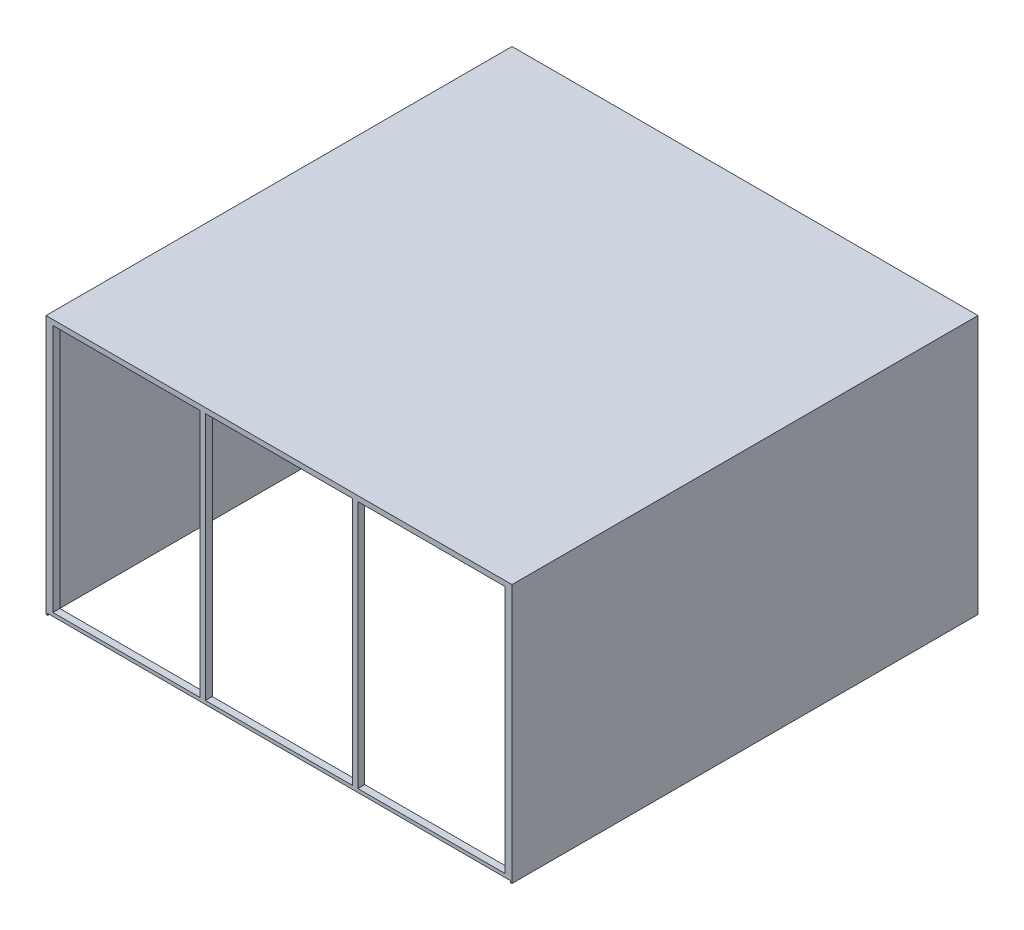
ISO-10303-21;
HEADER;
FILE_DESCRIPTION(('STEP AP214'),'2;1');
FILE_NAME('part.step','',(''),(''),'','','');
FILE_SCHEMA(('AUTOMOTIVE_DESIGN { 1 0 10303 214 1 1 1 1 }'));
ENDSEC;
DATA;
#1=APPLICATION_CONTEXT('core data for automotive mechanical design processes');
#2=APPLICATION_PROTOCOL_DEFINITION('international standard','automotive_design',2000,#1);
#3=PRODUCT_CONTEXT('',#1,'mechanical');
#4=PRODUCT('Part','Part','',(#3));
#5=PRODUCT_RELATED_PRODUCT_CATEGORY('part','',(#4));
#6=PRODUCT_DEFINITION_FORMATION('','',#4);
#7=PRODUCT_DEFINITION_CONTEXT('part definition',#1,'design');
#8=PRODUCT_DEFINITION('design','',#6,#7);
#9=PRODUCT_DEFINITION_SHAPE('','',#8);
#10=(LENGTH_UNIT() NAMED_UNIT(*) SI_UNIT(.MILLI.,.METRE.));
#11=(NAMED_UNIT(*) PLANE_ANGLE_UNIT() SI_UNIT($,.RADIAN.));
#12=(NAMED_UNIT(*) SI_UNIT($,.STERADIAN.) SOLID_ANGLE_UNIT());
#13=UNCERTAINTY_MEASURE_WITH_UNIT(LENGTH_MEASURE(1.E-05),#10,'distance_accuracy_value','');
#14=(GEOMETRIC_REPRESENTATION_CONTEXT(3) GLOBAL_UNCERTAINTY_ASSIGNED_CONTEXT((#13)) GLOBAL_UNIT_ASSIGNED_CONTEXT((#10,
#11,#12)) REPRESENTATION_CONTEXT('',''));
#15=CARTESIAN_POINT('',(0.,0.,0.));
#16=DIRECTION('',(0.,0.,1.));
#17=DIRECTION('',(1.,0.,0.));
#18=AXIS2_PLACEMENT_3D('',#15,#16,#17);
#19=CARTESIAN_POINT('',(-337.5,375.,0.));
#20=DIRECTION('',(1.,0.,0.));
#21=DIRECTION('',(0.,0.,-1.));
#22=AXIS2_PLACEMENT_3D('',#19,#20,#21);
#23=PLANE('',#22);
#24=DIRECTION('',(0.,0.,1.));
#25=VECTOR('',#24,1.);
#26=CARTESIAN_POINT('',(-337.5,0.,0.));
#27=LINE('',#26,#25);
#28=CARTESIAN_POINT('',(-337.5,0.,-675.));
#29=VERTEX_POINT('',#28);
#30=CARTESIAN_POINT('',(-337.5,0.,0.));
#31=VERTEX_POINT('',#30);
#32=EDGE_CURVE('E397',#29,#31,#27,.T.);
#33=ORIENTED_EDGE('',*,*,#32,.T.);
#34=DIRECTION('',(0.,-1.,0.));
#35=VECTOR('',#34,1.);
#36=CARTESIAN_POINT('',(-337.5,375.,0.));
#37=LINE('',#36,#35);
#38=CARTESIAN_POINT('',(-337.5,375.,0.));
#39=VERTEX_POINT('',#38);
#40=EDGE_CURVE('E447',#39,#31,#37,.T.);
#41=ORIENTED_EDGE('',*,*,#40,.F.);
#42=DIRECTION('',(0.,0.,1.));
#43=VECTOR('',#42,1.);
#44=CARTESIAN_POINT('',(-337.5,375.,0.));
#45=LINE('',#44,#43);
#46=CARTESIAN_POINT('',(-337.5,375.,-675.));
#47=VERTEX_POINT('',#46);
#48=EDGE_CURVE('E408',#47,#39,#45,.T.);
#49=ORIENTED_EDGE('',*,*,#48,.F.);
#50=DIRECTION('',(0.,-1.,0.));
#51=VECTOR('',#50,1.);
#52=CARTESIAN_POINT('',(-337.5,375.,-675.));
#53=LINE('',#52,#51);
#54=EDGE_CURVE('E422',#47,#29,#53,.T.);
#55=ORIENTED_EDGE('',*,*,#54,.T.);
#56=EDGE_LOOP('',(#33,#41,#49,#55));
#57=FACE_BOUND('',#56,.T.);
#58=ADVANCED_FACE('F45',(#57),#23,.F.);
#59=CARTESIAN_POINT('',(337.5,375.,-1.24301650113456E-13));
#60=DIRECTION('',(0.,0.,-1.));
#61=DIRECTION('',(-1.,0.,0.));
#62=AXIS2_PLACEMENT_3D('',#59,#60,#61);
#63=PLANE('',#62);
#64=DIRECTION('',(-1.,0.,0.));
#65=VECTOR('',#64,1.);
#66=CARTESIAN_POINT('',(114.17,367.5,0.));
#67=LINE('',#66,#65);
#68=CARTESIAN_POINT('',(327.5,367.5,-1.21240033115588E-13));
#69=VERTEX_POINT('',#68);
#70=CARTESIAN_POINT('',(114.17,367.5,0.));
#71=VERTEX_POINT('',#70);
#72=EDGE_CURVE('E275',#69,#71,#67,.T.);
#73=ORIENTED_EDGE('',*,*,#72,.F.);
#74=DIRECTION('',(0.,1.,0.));
#75=VECTOR('',#74,1.);
#76=CARTESIAN_POINT('',(327.5,367.5,0.));
#77=LINE('',#76,#75);
#78=CARTESIAN_POINT('',(327.5,7.50000000000008,0.));
#79=VERTEX_POINT('',#78);
#80=EDGE_CURVE('E60',#79,#69,#77,.T.);
#81=ORIENTED_EDGE('',*,*,#80,.F.);
#82=DIRECTION('',(1.,0.,0.));
#83=VECTOR('',#82,1.);
#84=CARTESIAN_POINT('',(327.5,7.50000000000008,0.));
#85=LINE('',#84,#83);
#86=CARTESIAN_POINT('',(114.17,7.50000000000008,0.));
#87=VERTEX_POINT('',#86);
#88=EDGE_CURVE('E266',#87,#79,#85,.T.);
#89=ORIENTED_EDGE('',*,*,#88,.F.);
#90=DIRECTION('',(0.,-1.,0.));
#91=VECTOR('',#90,1.);
#92=CARTESIAN_POINT('',(114.17,7.50000000000008,0.));
#93=LINE('',#92,#91);
#94=EDGE_CURVE('E270',#71,#87,#93,.T.);
#95=ORIENTED_EDGE('',*,*,#94,.F.);
#96=EDGE_LOOP('',(#73,#81,#89,#95));
#97=FACE_BOUND('',#96,.T.);
#98=DIRECTION('',(1.,0.,0.));
#99=VECTOR('',#98,1.);
#100=CARTESIAN_POINT('',(-114.17,7.50000000000011,0.));
#101=LINE('',#100,#99);
#102=CARTESIAN_POINT('',(-327.5,7.50000000000001,0.));
#103=VERTEX_POINT('',#102);
#104=CARTESIAN_POINT('',(-114.17,7.50000000000011,0.));
#105=VERTEX_POINT('',#104);
#106=EDGE_CURVE('E228',#103,#105,#101,.T.);
#107=ORIENTED_EDGE('',*,*,#106,.F.);
#108=DIRECTION('',(0.,-1.,0.));
#109=VECTOR('',#108,1.);
#110=CARTESIAN_POINT('',(-327.5,7.50000000000001,0.));
#111=LINE('',#110,#109);
#112=CARTESIAN_POINT('',(-327.5,367.5,0.));
#113=VERTEX_POINT('',#112);
#114=EDGE_CURVE('E68',#113,#103,#111,.T.);
#115=ORIENTED_EDGE('',*,*,#114,.F.);
#116=DIRECTION('',(-1.,0.,0.));
#117=VECTOR('',#116,1.);
#118=CARTESIAN_POINT('',(-327.5,367.5,0.));
#119=LINE('',#118,#117);
#120=CARTESIAN_POINT('',(-114.17,367.5,0.));
#121=VERTEX_POINT('',#120);
#122=EDGE_CURVE('E216',#121,#113,#119,.T.);
#123=ORIENTED_EDGE('',*,*,#122,.F.);
#124=DIRECTION('',(0.,1.,0.));
#125=VECTOR('',#124,1.);
#126=CARTESIAN_POINT('',(-114.17,367.5,0.));
#127=LINE('',#126,#125);
#128=EDGE_CURVE('E222',#105,#121,#127,.T.);
#129=ORIENTED_EDGE('',*,*,#128,.F.);
#130=EDGE_LOOP('',(#107,#115,#123,#129));
#131=FACE_BOUND('',#130,.T.);
#132=DIRECTION('',(1.,0.,0.));
#133=VECTOR('',#132,1.);
#134=CARTESIAN_POINT('',(106.67,7.50000000000001,0.));
#135=LINE('',#134,#133);
#136=CARTESIAN_POINT('',(-106.67,7.50000000000006,0.));
#137=VERTEX_POINT('',#136);
#138=CARTESIAN_POINT('',(106.67,7.50000000000001,0.));
#139=VERTEX_POINT('',#138);
#140=EDGE_CURVE('E234',#137,#139,#135,.T.);
#141=ORIENTED_EDGE('',*,*,#140,.F.);
#142=DIRECTION('',(0.,-1.,0.));
#143=VECTOR('',#142,1.);
#144=CARTESIAN_POINT('',(-106.67,7.50000000000008,0.));
#145=LINE('',#144,#143);
#146=CARTESIAN_POINT('',(-106.67,367.5,0.));
#147=VERTEX_POINT('',#146);
#148=EDGE_CURVE('E230',#147,#137,#145,.T.);
#149=ORIENTED_EDGE('',*,*,#148,.F.);
#150=DIRECTION('',(-1.,0.,0.));
#151=VECTOR('',#150,1.);
#152=CARTESIAN_POINT('',(-106.67,367.5,0.));
#153=LINE('',#152,#151);
#154=CARTESIAN_POINT('',(106.67,367.5,0.));
#155=VERTEX_POINT('',#154);
#156=EDGE_CURVE('E300',#155,#147,#153,.T.);
#157=ORIENTED_EDGE('',*,*,#156,.F.);
#158=DIRECTION('',(0.,1.,0.));
#159=VECTOR('',#158,1.);
#160=CARTESIAN_POINT('',(106.67,367.5,0.));
#161=LINE('',#160,#159);
#162=EDGE_CURVE('E316',#139,#155,#161,.T.);
#163=ORIENTED_EDGE('',*,*,#162,.F.);
#164=EDGE_LOOP('',(#141,#149,#157,#163));
#165=FACE_BOUND('',#164,.T.);
#166=DIRECTION('',(1.,0.,0.));
#167=VECTOR('',#166,1.);
#168=CARTESIAN_POINT('',(337.5,0.,-1.24301650113456E-13));
#169=LINE('',#168,#167);
#170=CARTESIAN_POINT('',(-335.,0.,0.));
#171=VERTEX_POINT('',#170);
#172=EDGE_CURVE('E427',#31,#171,#169,.T.);
#173=ORIENTED_EDGE('',*,*,#172,.T.);
#174=DIRECTION('',(0.,-1.,0.));
#175=VECTOR('',#174,1.);
#176=CARTESIAN_POINT('',(-335.,-2.5,0.));
#177=LINE('',#176,#175);
#178=CARTESIAN_POINT('',(-335.,2.5,0.));
#179=VERTEX_POINT('',#178);
#180=EDGE_CURVE('E326',#179,#171,#177,.T.);
#181=ORIENTED_EDGE('',*,*,#180,.F.);
#182=DIRECTION('',(-1.,0.,0.));
#183=VECTOR('',#182,1.);
#184=CARTESIAN_POINT('',(335.,2.5,0.));
#185=LINE('',#184,#183);
#186=CARTESIAN_POINT('',(335.,2.5,0.));
#187=VERTEX_POINT('',#186);
#188=EDGE_CURVE('E340',#187,#179,#185,.T.);
#189=ORIENTED_EDGE('',*,*,#188,.F.);
#190=DIRECTION('',(0.,1.,0.));
#191=VECTOR('',#190,1.);
#192=CARTESIAN_POINT('',(335.,-2.5,0.));
#193=LINE('',#192,#191);
#194=CARTESIAN_POINT('',(335.,0.,0.));
#195=VERTEX_POINT('',#194);
#196=EDGE_CURVE('E350',#195,#187,#193,.T.);
#197=ORIENTED_EDGE('',*,*,#196,.F.);
#198=CARTESIAN_POINT('',(337.5,0.,-1.24301650113456E-13));
#199=VERTEX_POINT('',#198);
#200=EDGE_CURVE('E426',#195,#199,#169,.T.);
#201=ORIENTED_EDGE('',*,*,#200,.T.);
#202=DIRECTION('',(0.,-1.,0.));
#203=VECTOR('',#202,1.);
#204=CARTESIAN_POINT('',(337.5,375.,-1.24301650113456E-13));
#205=LINE('',#204,#203);
#206=CARTESIAN_POINT('',(337.5,375.,-1.24301650113456E-13));
#207=VERTEX_POINT('',#206);
#208=EDGE_CURVE('E443',#207,#199,#205,.T.);
#209=ORIENTED_EDGE('',*,*,#208,.F.);
#210=DIRECTION('',(1.,0.,0.));
#211=VECTOR('',#210,1.);
#212=CARTESIAN_POINT('',(337.5,375.,-1.24301650113456E-13));
#213=LINE('',#212,#211);
#214=EDGE_CURVE('E412',#39,#207,#213,.T.);
#215=ORIENTED_EDGE('',*,*,#214,.F.);
#216=ORIENTED_EDGE('',*,*,#40,.T.);
#217=EDGE_LOOP('',(#173,#181,#189,#197,#201,#209,#215,#216));
#218=FACE_BOUND('',#217,.T.);
#219=ADVANCED_FACE('F225',(#97,#131,#165,#218),#63,.F.);
#220=CARTESIAN_POINT('',(337.5,375.,-675.));
#221=DIRECTION('',(-1.,0.,0.));
#222=DIRECTION('',(0.,0.,1.));
#223=AXIS2_PLACEMENT_3D('',#220,#221,#222);
#224=PLANE('',#223);
#225=DIRECTION('',(0.,0.,-1.));
#226=VECTOR('',#225,1.);
#227=CARTESIAN_POINT('',(337.5,0.,-675.));
#228=LINE('',#227,#226);
#229=CARTESIAN_POINT('',(337.5,0.,-675.));
#230=VERTEX_POINT('',#229);
#231=EDGE_CURVE('E431',#199,#230,#228,.T.);
#232=ORIENTED_EDGE('',*,*,#231,.T.);
#233=DIRECTION('',(0.,-1.,0.));
#234=VECTOR('',#233,1.);
#235=CARTESIAN_POINT('',(337.5,375.,-675.));
#236=LINE('',#235,#234);
#237=CARTESIAN_POINT('',(337.5,375.,-675.));
#238=VERTEX_POINT('',#237);
#239=EDGE_CURVE('E439',#238,#230,#236,.T.);
#240=ORIENTED_EDGE('',*,*,#239,.F.);
#241=DIRECTION('',(0.,0.,-1.));
#242=VECTOR('',#241,1.);
#243=CARTESIAN_POINT('',(337.5,375.,-675.));
#244=LINE('',#243,#242);
#245=EDGE_CURVE('E416',#207,#238,#244,.T.);
#246=ORIENTED_EDGE('',*,*,#245,.F.);
#247=ORIENTED_EDGE('',*,*,#208,.T.);
#248=EDGE_LOOP('',(#232,#240,#246,#247));
#249=FACE_BOUND('',#248,.T.);
#250=ADVANCED_FACE('F475',(#249),#224,.F.);
#251=CARTESIAN_POINT('',(-337.5,375.,-675.));
#252=DIRECTION('',(0.,0.,1.));
#253=DIRECTION('',(1.,0.,0.));
#254=AXIS2_PLACEMENT_3D('',#251,#252,#253);
#255=PLANE('',#254);
#256=DIRECTION('',(-1.,0.,0.));
#257=VECTOR('',#256,1.);
#258=CARTESIAN_POINT('',(-337.5,0.,-675.));
#259=LINE('',#258,#257);
#260=EDGE_CURVE('E413',#230,#29,#259,.T.);
#261=ORIENTED_EDGE('',*,*,#260,.T.);
#262=ORIENTED_EDGE('',*,*,#54,.F.);
#263=DIRECTION('',(-1.,0.,0.));
#264=VECTOR('',#263,1.);
#265=CARTESIAN_POINT('',(-337.5,375.,-675.));
#266=LINE('',#265,#264);
#267=EDGE_CURVE('E419',#238,#47,#266,.T.);
#268=ORIENTED_EDGE('',*,*,#267,.F.);
#269=ORIENTED_EDGE('',*,*,#239,.T.);
#270=EDGE_LOOP('',(#261,#262,#268,#269));
#271=FACE_BOUND('',#270,.T.);
#272=ADVANCED_FACE('F479',(#271),#255,.F.);
#273=CARTESIAN_POINT('',(0.,375.,0.));
#274=DIRECTION('',(0.,-1.,0.));
#275=DIRECTION('',(0.,0.,-1.));
#276=AXIS2_PLACEMENT_3D('',#273,#274,#275);
#277=PLANE('',#276);
#278=ORIENTED_EDGE('',*,*,#48,.T.);
#279=ORIENTED_EDGE('',*,*,#214,.T.);
#280=ORIENTED_EDGE('',*,*,#245,.T.);
#281=ORIENTED_EDGE('',*,*,#267,.T.);
#282=EDGE_LOOP('',(#278,#279,#280,#281));
#283=FACE_BOUND('',#282,.T.);
#284=ADVANCED_FACE('F483',(#283),#277,.F.);
#285=CARTESIAN_POINT('',(0.,0.,0.));
#286=DIRECTION('',(0.,-1.,0.));
#287=DIRECTION('',(0.,0.,-1.));
#288=AXIS2_PLACEMENT_3D('',#285,#286,#287);
#289=PLANE('',#288);
#290=DIRECTION('',(0.,0.,-1.));
#291=VECTOR('',#290,1.);
#292=CARTESIAN_POINT('',(-335.,0.,0.));
#293=LINE('',#292,#291);
#294=CARTESIAN_POINT('',(-335.,0.,-670.));
#295=VERTEX_POINT('',#294);
#296=EDGE_CURVE('E11',#171,#295,#293,.T.);
#297=ORIENTED_EDGE('',*,*,#296,.F.);
#298=ORIENTED_EDGE('',*,*,#172,.F.);
#299=ORIENTED_EDGE('',*,*,#32,.F.);
#300=ORIENTED_EDGE('',*,*,#260,.F.);
#301=ORIENTED_EDGE('',*,*,#231,.F.);
#302=ORIENTED_EDGE('',*,*,#200,.F.);
#303=DIRECTION('',(0.,0.,1.));
#304=VECTOR('',#303,1.);
#305=CARTESIAN_POINT('',(335.,0.,0.));
#306=LINE('',#305,#304);
#307=CARTESIAN_POINT('',(335.,0.,-670.));
#308=VERTEX_POINT('',#307);
#309=EDGE_CURVE('E53',#308,#195,#306,.T.);
#310=ORIENTED_EDGE('',*,*,#309,.F.);
#311=DIRECTION('',(-1.,0.,0.));
#312=VECTOR('',#311,1.);
#313=CARTESIAN_POINT('',(0.,0.,-670.));
#314=LINE('',#313,#312);
#315=EDGE_CURVE('E451',#308,#295,#314,.T.);
#316=ORIENTED_EDGE('',*,*,#315,.T.);
#317=EDGE_LOOP('',(#297,#298,#299,#300,#301,#302,#310,#316));
#318=FACE_BOUND('',#317,.T.);
#319=ADVANCED_FACE('F469',(#318),#289,.T.);
#320=CARTESIAN_POINT('',(335.,2.5,-670.));
#321=DIRECTION('',(0.,1.,0.));
#322=DIRECTION('',(0.,0.,1.));
#323=AXIS2_PLACEMENT_3D('',#320,#321,#322);
#324=PLANE('',#323);
#325=DIRECTION('',(1.,0.,0.));
#326=VECTOR('',#325,1.);
#327=CARTESIAN_POINT('',(335.,2.50000000000011,-10.));
#328=LINE('',#327,#326);
#329=CARTESIAN_POINT('',(-335.,2.5,-10.));
#330=VERTEX_POINT('',#329);
#331=CARTESIAN_POINT('',(335.,2.5,-10.));
#332=VERTEX_POINT('',#331);
#333=EDGE_CURVE('E384',#330,#332,#328,.T.);
#334=ORIENTED_EDGE('',*,*,#333,.T.);
#335=DIRECTION('',(0.,0.,1.));
#336=VECTOR('',#335,1.);
#337=CARTESIAN_POINT('',(335.,2.5,-670.));
#338=LINE('',#337,#336);
#339=EDGE_CURVE('E347',#332,#187,#338,.T.);
#340=ORIENTED_EDGE('',*,*,#339,.T.);
#341=ORIENTED_EDGE('',*,*,#188,.T.);
#342=DIRECTION('',(0.,0.,1.));
#343=VECTOR('',#342,1.);
#344=CARTESIAN_POINT('',(-335.,2.5,-670.));
#345=LINE('',#344,#343);
#346=EDGE_CURVE('E357',#330,#179,#345,.T.);
#347=ORIENTED_EDGE('',*,*,#346,.F.);
#348=EDGE_LOOP('',(#334,#340,#341,#347));
#349=FACE_BOUND('',#348,.T.);
#350=ADVANCED_FACE('F491',(#349),#324,.F.);
#351=CARTESIAN_POINT('',(0.,0.,-670.));
#352=DIRECTION('',(0.,0.,1.));
#353=DIRECTION('',(1.,0.,0.));
#354=AXIS2_PLACEMENT_3D('',#351,#352,#353);
#355=PLANE('',#354);
#356=DIRECTION('',(0.,1.,0.));
#357=VECTOR('',#356,1.);
#358=CARTESIAN_POINT('',(335.,-2.5,-670.));
#359=LINE('',#358,#357);
#360=CARTESIAN_POINT('',(335.,2.50000000000011,-670.));
#361=VERTEX_POINT('',#360);
#362=EDGE_CURVE('E339',#308,#361,#359,.T.);
#363=ORIENTED_EDGE('',*,*,#362,.T.);
#364=DIRECTION('',(-1.,0.,0.));
#365=VECTOR('',#364,1.);
#366=CARTESIAN_POINT('',(335.,2.5,-670.));
#367=LINE('',#366,#365);
#368=CARTESIAN_POINT('',(-335.,2.5,-670.));
#369=VERTEX_POINT('',#368);
#370=EDGE_CURVE('E343',#361,#369,#367,.T.);
#371=ORIENTED_EDGE('',*,*,#370,.T.);
#372=DIRECTION('',(0.,-1.,0.));
#373=VECTOR('',#372,1.);
#374=CARTESIAN_POINT('',(-335.,-2.5,-670.));
#375=LINE('',#374,#373);
#376=EDGE_CURVE('E336',#369,#295,#375,.T.);
#377=ORIENTED_EDGE('',*,*,#376,.T.);
#378=ORIENTED_EDGE('',*,*,#315,.F.);
#379=EDGE_LOOP('',(#363,#371,#377,#378));
#380=FACE_BOUND('',#379,.T.);
#381=ADVANCED_FACE('F508',(#380),#355,.T.);
#382=CARTESIAN_POINT('',(335.,2.50000000000011,-672.5));
#383=DIRECTION('',(0.,-1.,0.));
#384=DIRECTION('',(1.,0.,0.));
#385=AXIS2_PLACEMENT_3D('',#382,#383,#384);
#386=PLANE('',#385);
#387=ORIENTED_EDGE('',*,*,#370,.F.);
#388=DIRECTION('',(0.,0.,1.));
#389=VECTOR('',#388,1.);
#390=CARTESIAN_POINT('',(335.,2.50000000000011,-672.5));
#391=LINE('',#390,#389);
#392=CARTESIAN_POINT('',(335.,2.50000000000011,-672.5));
#393=VERTEX_POINT('',#392);
#394=EDGE_CURVE('E401',#393,#361,#391,.T.);
#395=ORIENTED_EDGE('',*,*,#394,.F.);
#396=DIRECTION('',(1.,0.,0.));
#397=VECTOR('',#396,1.);
#398=CARTESIAN_POINT('',(335.,2.50000000000011,-672.5));
#399=LINE('',#398,#397);
#400=CARTESIAN_POINT('',(-335.,2.50000000000003,-672.5));
#401=VERTEX_POINT('',#400);
#402=EDGE_CURVE('E367',#401,#393,#399,.T.);
#403=ORIENTED_EDGE('',*,*,#402,.F.);
#404=DIRECTION('',(0.,0.,1.));
#405=VECTOR('',#404,1.);
#406=CARTESIAN_POINT('',(-335.,2.50000000000003,-672.5));
#407=LINE('',#406,#405);
#408=EDGE_CURVE('E380',#401,#369,#407,.T.);
#409=ORIENTED_EDGE('',*,*,#408,.T.);
#410=EDGE_LOOP('',(#387,#395,#403,#409));
#411=FACE_BOUND('',#410,.T.);
#412=ADVANCED_FACE('F506',(#411),#386,.F.);
#413=CARTESIAN_POINT('',(-335.,2.50000000000003,-672.5));
#414=DIRECTION('',(-1.,0.,0.));
#415=DIRECTION('',(0.,0.,1.));
#416=AXIS2_PLACEMENT_3D('',#413,#414,#415);
#417=PLANE('',#416);
#418=DIRECTION('',(0.,-1.,0.));
#419=VECTOR('',#418,1.);
#420=CARTESIAN_POINT('',(-335.,2.50000000000003,-10.));
#421=LINE('',#420,#419);
#422=CARTESIAN_POINT('',(-335.,372.5,-10.));
#423=VERTEX_POINT('',#422);
#424=EDGE_CURVE('E360',#423,#330,#421,.T.);
#425=ORIENTED_EDGE('',*,*,#424,.T.);
#426=ORIENTED_EDGE('',*,*,#346,.T.);
#427=ORIENTED_EDGE('',*,*,#180,.T.);
#428=ORIENTED_EDGE('',*,*,#296,.T.);
#429=ORIENTED_EDGE('',*,*,#376,.F.);
#430=ORIENTED_EDGE('',*,*,#408,.F.);
#431=DIRECTION('',(0.,-1.,0.));
#432=VECTOR('',#431,1.);
#433=CARTESIAN_POINT('',(-335.,2.50000000000003,-672.5));
#434=LINE('',#433,#432);
#435=CARTESIAN_POINT('',(-335.,372.5,-672.5));
#436=VERTEX_POINT('',#435);
#437=EDGE_CURVE('E363',#436,#401,#434,.T.);
#438=ORIENTED_EDGE('',*,*,#437,.F.);
#439=DIRECTION('',(0.,0.,1.));
#440=VECTOR('',#439,1.);
#441=CARTESIAN_POINT('',(-335.,372.5,-672.5));
#442=LINE('',#441,#440);
#443=EDGE_CURVE('E394',#436,#423,#442,.T.);
#444=ORIENTED_EDGE('',*,*,#443,.T.);
#445=EDGE_LOOP('',(#425,#426,#427,#428,#429,#430,#438,#444));
#446=FACE_BOUND('',#445,.T.);
#447=ADVANCED_FACE('F487',(#446),#417,.F.);
#448=CARTESIAN_POINT('',(335.,372.5,-672.5));
#449=DIRECTION('',(0.,1.,0.));
#450=DIRECTION('',(-1.,0.,0.));
#451=AXIS2_PLACEMENT_3D('',#448,#449,#450);
#452=PLANE('',#451);
#453=DIRECTION('',(-1.,0.,0.));
#454=VECTOR('',#453,1.);
#455=CARTESIAN_POINT('',(335.,372.5,-10.));
#456=LINE('',#455,#454);
#457=CARTESIAN_POINT('',(335.,372.5,-10.));
#458=VERTEX_POINT('',#457);
#459=EDGE_CURVE('E368',#458,#423,#456,.T.);
#460=ORIENTED_EDGE('',*,*,#459,.T.);
#461=ORIENTED_EDGE('',*,*,#443,.F.);
#462=DIRECTION('',(-1.,0.,0.));
#463=VECTOR('',#462,1.);
#464=CARTESIAN_POINT('',(335.,372.5,-672.5));
#465=LINE('',#464,#463);
#466=CARTESIAN_POINT('',(335.,372.5,-672.5));
#467=VERTEX_POINT('',#466);
#468=EDGE_CURVE('E376',#467,#436,#465,.T.);
#469=ORIENTED_EDGE('',*,*,#468,.F.);
#470=DIRECTION('',(0.,0.,1.));
#471=VECTOR('',#470,1.);
#472=CARTESIAN_POINT('',(335.,372.5,-672.5));
#473=LINE('',#472,#471);
#474=EDGE_CURVE('E398',#467,#458,#473,.T.);
#475=ORIENTED_EDGE('',*,*,#474,.T.);
#476=EDGE_LOOP('',(#460,#461,#469,#475));
#477=FACE_BOUND('',#476,.T.);
#478=ADVANCED_FACE('F497',(#477),#452,.F.);
#479=CARTESIAN_POINT('',(335.,2.50000000000011,-672.5));
#480=DIRECTION('',(1.,0.,0.));
#481=DIRECTION('',(0.,0.,-1.));
#482=AXIS2_PLACEMENT_3D('',#479,#480,#481);
#483=PLANE('',#482);
#484=DIRECTION('',(0.,1.,0.));
#485=VECTOR('',#484,1.);
#486=CARTESIAN_POINT('',(335.,2.50000000000011,-10.));
#487=LINE('',#486,#485);
#488=EDGE_CURVE('E387',#332,#458,#487,.T.);
#489=ORIENTED_EDGE('',*,*,#488,.T.);
#490=ORIENTED_EDGE('',*,*,#474,.F.);
#491=DIRECTION('',(0.,1.,0.));
#492=VECTOR('',#491,1.);
#493=CARTESIAN_POINT('',(335.,2.50000000000011,-672.5));
#494=LINE('',#493,#492);
#495=EDGE_CURVE('E372',#393,#467,#494,.T.);
#496=ORIENTED_EDGE('',*,*,#495,.F.);
#497=ORIENTED_EDGE('',*,*,#394,.T.);
#498=ORIENTED_EDGE('',*,*,#362,.F.);
#499=ORIENTED_EDGE('',*,*,#309,.T.);
#500=ORIENTED_EDGE('',*,*,#196,.T.);
#501=ORIENTED_EDGE('',*,*,#339,.F.);
#502=EDGE_LOOP('',(#489,#490,#496,#497,#498,#499,#500,#501));
#503=FACE_BOUND('',#502,.T.);
#504=ADVANCED_FACE('F459',(#503),#483,.F.);
#505=CARTESIAN_POINT('',(0.,0.,-672.5));
#506=DIRECTION('',(0.,0.,1.));
#507=DIRECTION('',(1.,0.,0.));
#508=AXIS2_PLACEMENT_3D('',#505,#506,#507);
#509=PLANE('',#508);
#510=ORIENTED_EDGE('',*,*,#437,.T.);
#511=ORIENTED_EDGE('',*,*,#402,.T.);
#512=ORIENTED_EDGE('',*,*,#495,.T.);
#513=ORIENTED_EDGE('',*,*,#468,.T.);
#514=EDGE_LOOP('',(#510,#511,#512,#513));
#515=FACE_BOUND('',#514,.T.);
#516=ADVANCED_FACE('F502',(#515),#509,.T.);
#517=CARTESIAN_POINT('',(0.,0.,-10.));
#518=DIRECTION('',(0.,0.,1.));
#519=DIRECTION('',(1.,0.,0.));
#520=AXIS2_PLACEMENT_3D('',#517,#518,#519);
#521=PLANE('',#520);
#522=DIRECTION('',(1.,0.,0.));
#523=VECTOR('',#522,1.);
#524=CARTESIAN_POINT('',(327.5,7.50000000000008,-10.));
#525=LINE('',#524,#523);
#526=CARTESIAN_POINT('',(114.17,7.50000000000008,-10.));
#527=VERTEX_POINT('',#526);
#528=CARTESIAN_POINT('',(327.5,7.50000000000008,-10.));
#529=VERTEX_POINT('',#528);
#530=EDGE_CURVE('E256',#527,#529,#525,.T.);
#531=ORIENTED_EDGE('',*,*,#530,.T.);
#532=DIRECTION('',(0.,1.,0.));
#533=VECTOR('',#532,1.);
#534=CARTESIAN_POINT('',(327.5,367.5,-10.));
#535=LINE('',#534,#533);
#536=CARTESIAN_POINT('',(327.5,367.5,-10.));
#537=VERTEX_POINT('',#536);
#538=EDGE_CURVE('E271',#529,#537,#535,.T.);
#539=ORIENTED_EDGE('',*,*,#538,.T.);
#540=DIRECTION('',(-1.,0.,0.));
#541=VECTOR('',#540,1.);
#542=CARTESIAN_POINT('',(114.17,367.5,-10.));
#543=LINE('',#542,#541);
#544=CARTESIAN_POINT('',(114.17,367.5,-10.));
#545=VERTEX_POINT('',#544);
#546=EDGE_CURVE('E288',#537,#545,#543,.T.);
#547=ORIENTED_EDGE('',*,*,#546,.T.);
#548=DIRECTION('',(0.,-1.,0.));
#549=VECTOR('',#548,1.);
#550=CARTESIAN_POINT('',(114.17,7.50000000000008,-10.));
#551=LINE('',#550,#549);
#552=EDGE_CURVE('E284',#545,#527,#551,.T.);
#553=ORIENTED_EDGE('',*,*,#552,.T.);
#554=EDGE_LOOP('',(#531,#539,#547,#553));
#555=FACE_BOUND('',#554,.T.);
#556=DIRECTION('',(-1.,0.,0.));
#557=VECTOR('',#556,1.);
#558=CARTESIAN_POINT('',(-327.5,367.5,-10.));
#559=LINE('',#558,#557);
#560=CARTESIAN_POINT('',(-114.17,367.5,-10.));
#561=VERTEX_POINT('',#560);
#562=CARTESIAN_POINT('',(-327.5,367.5,-10.));
#563=VERTEX_POINT('',#562);
#564=EDGE_CURVE('E239',#561,#563,#559,.T.);
#565=ORIENTED_EDGE('',*,*,#564,.T.);
#566=DIRECTION('',(0.,-1.,0.));
#567=VECTOR('',#566,1.);
#568=CARTESIAN_POINT('',(-327.5,7.50000000000001,-10.));
#569=LINE('',#568,#567);
#570=CARTESIAN_POINT('',(-327.5,7.50000000000001,-10.));
#571=VERTEX_POINT('',#570);
#572=EDGE_CURVE('E208',#563,#571,#569,.T.);
#573=ORIENTED_EDGE('',*,*,#572,.T.);
#574=DIRECTION('',(1.,0.,0.));
#575=VECTOR('',#574,1.);
#576=CARTESIAN_POINT('',(-114.17,7.50000000000011,-10.));
#577=LINE('',#576,#575);
#578=CARTESIAN_POINT('',(-114.17,7.50000000000011,-10.));
#579=VERTEX_POINT('',#578);
#580=EDGE_CURVE('E247',#571,#579,#577,.T.);
#581=ORIENTED_EDGE('',*,*,#580,.T.);
#582=DIRECTION('',(0.,1.,0.));
#583=VECTOR('',#582,1.);
#584=CARTESIAN_POINT('',(-114.17,367.5,-10.));
#585=LINE('',#584,#583);
#586=EDGE_CURVE('E242',#579,#561,#585,.T.);
#587=ORIENTED_EDGE('',*,*,#586,.T.);
#588=EDGE_LOOP('',(#565,#573,#581,#587));
#589=FACE_BOUND('',#588,.T.);
#590=DIRECTION('',(-1.,0.,0.));
#591=VECTOR('',#590,1.);
#592=CARTESIAN_POINT('',(-106.67,367.5,-10.));
#593=LINE('',#592,#591);
#594=CARTESIAN_POINT('',(106.67,367.5,-10.));
#595=VERTEX_POINT('',#594);
#596=CARTESIAN_POINT('',(-106.67,367.5,-10.));
#597=VERTEX_POINT('',#596);
#598=EDGE_CURVE('E308',#595,#597,#593,.T.);
#599=ORIENTED_EDGE('',*,*,#598,.T.);
#600=DIRECTION('',(0.,-1.,0.));
#601=VECTOR('',#600,1.);
#602=CARTESIAN_POINT('',(-106.67,7.50000000000008,-10.));
#603=LINE('',#602,#601);
#604=CARTESIAN_POINT('',(-106.67,7.50000000000008,-10.));
#605=VERTEX_POINT('',#604);
#606=EDGE_CURVE('E295',#597,#605,#603,.T.);
#607=ORIENTED_EDGE('',*,*,#606,.T.);
#608=DIRECTION('',(1.,0.,0.));
#609=VECTOR('',#608,1.);
#610=CARTESIAN_POINT('',(106.67,7.50000000000001,-10.));
#611=LINE('',#610,#609);
#612=CARTESIAN_POINT('',(106.67,7.50000000000001,-10.));
#613=VERTEX_POINT('',#612);
#614=EDGE_CURVE('E299',#605,#613,#611,.T.);
#615=ORIENTED_EDGE('',*,*,#614,.T.);
#616=DIRECTION('',(0.,1.,0.));
#617=VECTOR('',#616,1.);
#618=CARTESIAN_POINT('',(106.67,367.5,-10.));
#619=LINE('',#618,#617);
#620=EDGE_CURVE('E304',#613,#595,#619,.T.);
#621=ORIENTED_EDGE('',*,*,#620,.T.);
#622=EDGE_LOOP('',(#599,#607,#615,#621));
#623=FACE_BOUND('',#622,.T.);
#624=ORIENTED_EDGE('',*,*,#424,.F.);
#625=ORIENTED_EDGE('',*,*,#459,.F.);
#626=ORIENTED_EDGE('',*,*,#488,.F.);
#627=ORIENTED_EDGE('',*,*,#333,.F.);
#628=EDGE_LOOP('',(#624,#625,#626,#627));
#629=FACE_BOUND('',#628,.T.);
#630=ADVANCED_FACE('F495',(#555,#589,#623,#629),#521,.F.);
#631=CARTESIAN_POINT('',(-106.67,7.50000000000008,-10.));
#632=DIRECTION('',(-1.,0.,0.));
#633=DIRECTION('',(0.,0.,1.));
#634=AXIS2_PLACEMENT_3D('',#631,#632,#633);
#635=PLANE('',#634);
#636=ORIENTED_EDGE('',*,*,#148,.T.);
#637=DIRECTION('',(0.,0.,1.));
#638=VECTOR('',#637,1.);
#639=CARTESIAN_POINT('',(-106.67,7.50000000000008,-10.));
#640=LINE('',#639,#638);
#641=EDGE_CURVE('E311',#605,#137,#640,.T.);
#642=ORIENTED_EDGE('',*,*,#641,.F.);
#643=ORIENTED_EDGE('',*,*,#606,.F.);
#644=DIRECTION('',(0.,0.,1.));
#645=VECTOR('',#644,1.);
#646=CARTESIAN_POINT('',(-106.67,367.5,-10.));
#647=LINE('',#646,#645);
#648=EDGE_CURVE('E323',#597,#147,#647,.T.);
#649=ORIENTED_EDGE('',*,*,#648,.T.);
#650=EDGE_LOOP('',(#636,#642,#643,#649));
#651=FACE_BOUND('',#650,.T.);
#652=ADVANCED_FACE('F543',(#651),#635,.F.);
#653=CARTESIAN_POINT('',(-106.67,367.5,-10.));
#654=DIRECTION('',(0.,1.,0.));
#655=DIRECTION('',(-1.,0.,0.));
#656=AXIS2_PLACEMENT_3D('',#653,#654,#655);
#657=PLANE('',#656);
#658=ORIENTED_EDGE('',*,*,#156,.T.);
#659=ORIENTED_EDGE('',*,*,#648,.F.);
#660=ORIENTED_EDGE('',*,*,#598,.F.);
#661=DIRECTION('',(0.,0.,1.));
#662=VECTOR('',#661,1.);
#663=CARTESIAN_POINT('',(106.67,367.5,-10.));
#664=LINE('',#663,#662);
#665=EDGE_CURVE('E327',#595,#155,#664,.T.);
#666=ORIENTED_EDGE('',*,*,#665,.T.);
#667=EDGE_LOOP('',(#658,#659,#660,#666));
#668=FACE_BOUND('',#667,.T.);
#669=ADVANCED_FACE('F596',(#668),#657,.F.);
#670=CARTESIAN_POINT('',(106.67,367.5,-10.));
#671=DIRECTION('',(1.,0.,0.));
#672=DIRECTION('',(0.,0.,-1.));
#673=AXIS2_PLACEMENT_3D('',#670,#671,#672);
#674=PLANE('',#673);
#675=ORIENTED_EDGE('',*,*,#162,.T.);
#676=ORIENTED_EDGE('',*,*,#665,.F.);
#677=ORIENTED_EDGE('',*,*,#620,.F.);
#678=DIRECTION('',(0.,0.,1.));
#679=VECTOR('',#678,1.);
#680=CARTESIAN_POINT('',(106.67,7.50000000000001,-10.));
#681=LINE('',#680,#679);
#682=EDGE_CURVE('E330',#613,#139,#681,.T.);
#683=ORIENTED_EDGE('',*,*,#682,.T.);
#684=EDGE_LOOP('',(#675,#676,#677,#683));
#685=FACE_BOUND('',#684,.T.);
#686=ADVANCED_FACE('F605',(#685),#674,.F.);
#687=CARTESIAN_POINT('',(106.67,7.50000000000001,-10.));
#688=DIRECTION('',(0.,-1.,0.));
#689=DIRECTION('',(1.,0.,0.));
#690=AXIS2_PLACEMENT_3D('',#687,#688,#689);
#691=PLANE('',#690);
#692=ORIENTED_EDGE('',*,*,#140,.T.);
#693=ORIENTED_EDGE('',*,*,#682,.F.);
#694=ORIENTED_EDGE('',*,*,#614,.F.);
#695=ORIENTED_EDGE('',*,*,#641,.T.);
#696=EDGE_LOOP('',(#692,#693,#694,#695));
#697=FACE_BOUND('',#696,.T.);
#698=ADVANCED_FACE('F615',(#697),#691,.F.);
#699=CARTESIAN_POINT('',(-327.5,7.50000000000001,-10.));
#700=DIRECTION('',(-1.,0.,0.));
#701=DIRECTION('',(0.,0.,1.));
#702=AXIS2_PLACEMENT_3D('',#699,#700,#701);
#703=PLANE('',#702);
#704=ORIENTED_EDGE('',*,*,#114,.T.);
#705=DIRECTION('',(0.,0.,1.));
#706=VECTOR('',#705,1.);
#707=CARTESIAN_POINT('',(-327.5,7.50000000000001,-10.));
#708=LINE('',#707,#706);
#709=EDGE_CURVE('E243',#571,#103,#708,.T.);
#710=ORIENTED_EDGE('',*,*,#709,.F.);
#711=ORIENTED_EDGE('',*,*,#572,.F.);
#712=DIRECTION('',(0.,0.,1.));
#713=VECTOR('',#712,1.);
#714=CARTESIAN_POINT('',(-327.5,367.5,-10.));
#715=LINE('',#714,#713);
#716=EDGE_CURVE('E204',#563,#113,#715,.T.);
#717=ORIENTED_EDGE('',*,*,#716,.T.);
#718=EDGE_LOOP('',(#704,#710,#711,#717));
#719=FACE_BOUND('',#718,.T.);
#720=ADVANCED_FACE('F206',(#719),#703,.F.);
#721=CARTESIAN_POINT('',(-327.5,367.5,-10.));
#722=DIRECTION('',(0.,1.,0.));
#723=DIRECTION('',(-1.,0.,0.));
#724=AXIS2_PLACEMENT_3D('',#721,#722,#723);
#725=PLANE('',#724);
#726=ORIENTED_EDGE('',*,*,#122,.T.);
#727=ORIENTED_EDGE('',*,*,#716,.F.);
#728=ORIENTED_EDGE('',*,*,#564,.F.);
#729=DIRECTION('',(0.,0.,1.));
#730=VECTOR('',#729,1.);
#731=CARTESIAN_POINT('',(-114.17,367.5,-10.));
#732=LINE('',#731,#730);
#733=EDGE_CURVE('E213',#561,#121,#732,.T.);
#734=ORIENTED_EDGE('',*,*,#733,.T.);
#735=EDGE_LOOP('',(#726,#727,#728,#734));
#736=FACE_BOUND('',#735,.T.);
#737=ADVANCED_FACE('F217',(#736),#725,.F.);
#738=CARTESIAN_POINT('',(-114.17,367.5,-10.));
#739=DIRECTION('',(1.,0.,0.));
#740=DIRECTION('',(0.,0.,-1.));
#741=AXIS2_PLACEMENT_3D('',#738,#739,#740);
#742=PLANE('',#741);
#743=ORIENTED_EDGE('',*,*,#128,.T.);
#744=ORIENTED_EDGE('',*,*,#733,.F.);
#745=ORIENTED_EDGE('',*,*,#586,.F.);
#746=DIRECTION('',(0.,0.,1.));
#747=VECTOR('',#746,1.);
#748=CARTESIAN_POINT('',(-114.17,7.50000000000011,-10.));
#749=LINE('',#748,#747);
#750=EDGE_CURVE('E721',#579,#105,#749,.T.);
#751=ORIENTED_EDGE('',*,*,#750,.T.);
#752=EDGE_LOOP('',(#743,#744,#745,#751));
#753=FACE_BOUND('',#752,.T.);
#754=ADVANCED_FACE('F642',(#753),#742,.F.);
#755=CARTESIAN_POINT('',(-114.17,7.50000000000011,-10.));
#756=DIRECTION('',(0.,-1.,0.));
#757=DIRECTION('',(1.,0.,0.));
#758=AXIS2_PLACEMENT_3D('',#755,#756,#757);
#759=PLANE('',#758);
#760=ORIENTED_EDGE('',*,*,#106,.T.);
#761=ORIENTED_EDGE('',*,*,#750,.F.);
#762=ORIENTED_EDGE('',*,*,#580,.F.);
#763=ORIENTED_EDGE('',*,*,#709,.T.);
#764=EDGE_LOOP('',(#760,#761,#762,#763));
#765=FACE_BOUND('',#764,.T.);
#766=ADVANCED_FACE('F651',(#765),#759,.F.);
#767=CARTESIAN_POINT('',(327.5,367.5,-10.));
#768=DIRECTION('',(1.,0.,0.));
#769=DIRECTION('',(0.,0.,-1.));
#770=AXIS2_PLACEMENT_3D('',#767,#768,#769);
#771=PLANE('',#770);
#772=ORIENTED_EDGE('',*,*,#80,.T.);
#773=DIRECTION('',(0.,0.,1.));
#774=VECTOR('',#773,1.);
#775=CARTESIAN_POINT('',(327.5,367.5,-10.));
#776=LINE('',#775,#774);
#777=EDGE_CURVE('E253',#537,#69,#776,.T.);
#778=ORIENTED_EDGE('',*,*,#777,.F.);
#779=ORIENTED_EDGE('',*,*,#538,.F.);
#780=DIRECTION('',(0.,0.,1.));
#781=VECTOR('',#780,1.);
#782=CARTESIAN_POINT('',(327.5,7.50000000000008,-10.));
#783=LINE('',#782,#781);
#784=EDGE_CURVE('E263',#529,#79,#783,.T.);
#785=ORIENTED_EDGE('',*,*,#784,.T.);
#786=EDGE_LOOP('',(#772,#778,#779,#785));
#787=FACE_BOUND('',#786,.T.);
#788=ADVANCED_FACE('F661',(#787),#771,.F.);
#789=CARTESIAN_POINT('',(327.5,7.50000000000008,-10.));
#790=DIRECTION('',(0.,-1.,0.));
#791=DIRECTION('',(1.,0.,0.));
#792=AXIS2_PLACEMENT_3D('',#789,#790,#791);
#793=PLANE('',#792);
#794=ORIENTED_EDGE('',*,*,#88,.T.);
#795=ORIENTED_EDGE('',*,*,#784,.F.);
#796=ORIENTED_EDGE('',*,*,#530,.F.);
#797=DIRECTION('',(0.,0.,1.));
#798=VECTOR('',#797,1.);
#799=CARTESIAN_POINT('',(114.17,7.50000000000008,-10.));
#800=LINE('',#799,#798);
#801=EDGE_CURVE('E260',#527,#87,#800,.T.);
#802=ORIENTED_EDGE('',*,*,#801,.T.);
#803=EDGE_LOOP('',(#794,#795,#796,#802));
#804=FACE_BOUND('',#803,.T.);
#805=ADVANCED_FACE('F671',(#804),#793,.F.);
#806=CARTESIAN_POINT('',(114.17,7.50000000000008,-10.));
#807=DIRECTION('',(-1.,0.,0.));
#808=DIRECTION('',(0.,0.,1.));
#809=AXIS2_PLACEMENT_3D('',#806,#807,#808);
#810=PLANE('',#809);
#811=ORIENTED_EDGE('',*,*,#94,.T.);
#812=ORIENTED_EDGE('',*,*,#801,.F.);
#813=ORIENTED_EDGE('',*,*,#552,.F.);
#814=DIRECTION('',(0.,0.,1.));
#815=VECTOR('',#814,1.);
#816=CARTESIAN_POINT('',(114.17,367.5,-10.));
#817=LINE('',#816,#815);
#818=EDGE_CURVE('E257',#545,#71,#817,.T.);
#819=ORIENTED_EDGE('',*,*,#818,.T.);
#820=EDGE_LOOP('',(#811,#812,#813,#819));
#821=FACE_BOUND('',#820,.T.);
#822=ADVANCED_FACE('F680',(#821),#810,.F.);
#823=CARTESIAN_POINT('',(114.17,367.5,-10.));
#824=DIRECTION('',(0.,1.,0.));
#825=DIRECTION('',(-1.,0.,0.));
#826=AXIS2_PLACEMENT_3D('',#823,#824,#825);
#827=PLANE('',#826);
#828=ORIENTED_EDGE('',*,*,#72,.T.);
#829=ORIENTED_EDGE('',*,*,#818,.F.);
#830=ORIENTED_EDGE('',*,*,#546,.F.);
#831=ORIENTED_EDGE('',*,*,#777,.T.);
#832=EDGE_LOOP('',(#828,#829,#830,#831));
#833=FACE_BOUND('',#832,.T.);
#834=ADVANCED_FACE('F690',(#833),#827,.F.);
#835=CLOSED_SHELL('',(#58,#219,#250,#272,#284,#319,#350,#381,#412,#447,#478,#504,#516,#630,#652,
#669,#686,#698,#720,#737,#754,#766,#788,#805,#822,#834));
#836=MANIFOLD_SOLID_BREP('B2',#835);
#837=ADVANCED_BREP_SHAPE_REPRESENTATION('',(#18,#836),#14);
#838=SHAPE_DEFINITION_REPRESENTATION(#9,#837);
ENDSEC;
END-ISO-10303-21;
